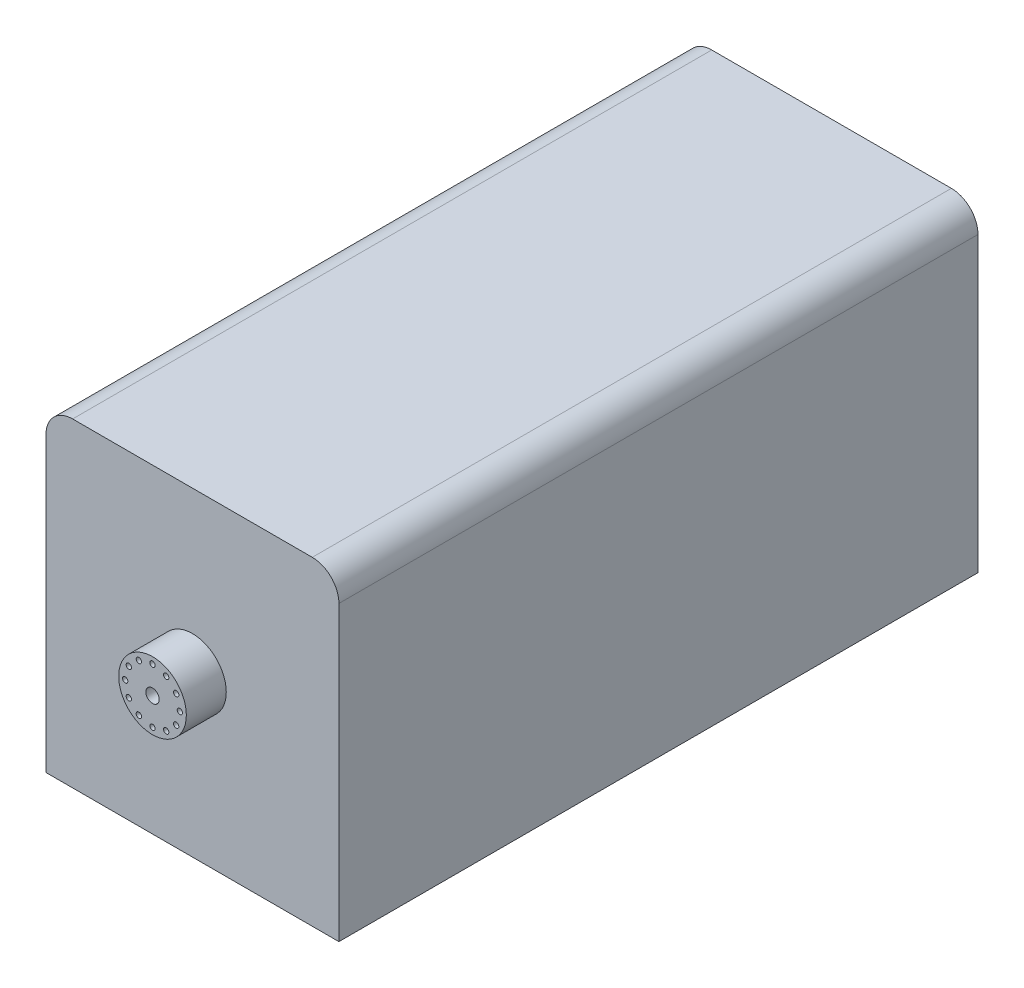
ISO-10303-21;
HEADER;
FILE_DESCRIPTION(('STEP AP214'),'2;1');
FILE_NAME('part.step','',(''),(''),'','','');
FILE_SCHEMA(('AUTOMOTIVE_DESIGN { 1 0 10303 214 1 1 1 1 }'));
ENDSEC;
DATA;
#1=APPLICATION_CONTEXT('core data for automotive mechanical design processes');
#2=APPLICATION_PROTOCOL_DEFINITION('international standard','automotive_design',2000,#1);
#3=PRODUCT_CONTEXT('',#1,'mechanical');
#4=PRODUCT('Part','Part','',(#3));
#5=PRODUCT_RELATED_PRODUCT_CATEGORY('part','',(#4));
#6=PRODUCT_DEFINITION_FORMATION('','',#4);
#7=PRODUCT_DEFINITION_CONTEXT('part definition',#1,'design');
#8=PRODUCT_DEFINITION('design','',#6,#7);
#9=PRODUCT_DEFINITION_SHAPE('','',#8);
#10=(LENGTH_UNIT() NAMED_UNIT(*) SI_UNIT(.MILLI.,.METRE.));
#11=(NAMED_UNIT(*) PLANE_ANGLE_UNIT() SI_UNIT($,.RADIAN.));
#12=(NAMED_UNIT(*) SI_UNIT($,.STERADIAN.) SOLID_ANGLE_UNIT());
#13=UNCERTAINTY_MEASURE_WITH_UNIT(LENGTH_MEASURE(1.E-05),#10,'distance_accuracy_value','');
#14=(GEOMETRIC_REPRESENTATION_CONTEXT(3) GLOBAL_UNCERTAINTY_ASSIGNED_CONTEXT((#13)) GLOBAL_UNIT_ASSIGNED_CONTEXT((#10,
#11,#12)) REPRESENTATION_CONTEXT('',''));
#15=CARTESIAN_POINT('',(0.,0.,0.));
#16=DIRECTION('',(0.,0.,1.));
#17=DIRECTION('',(1.,0.,0.));
#18=AXIS2_PLACEMENT_3D('',#15,#16,#17);
#19=CARTESIAN_POINT('',(-55.,60.,240.));
#20=DIRECTION('',(1.,0.,0.));
#21=DIRECTION('',(0.,1.,0.));
#22=AXIS2_PLACEMENT_3D('',#19,#20,#21);
#23=PLANE('',#22);
#24=DIRECTION('',(0.,-1.,0.));
#25=VECTOR('',#24,1.);
#26=CARTESIAN_POINT('',(-55.,60.,240.));
#27=LINE('',#26,#25);
#28=CARTESIAN_POINT('',(-55.,50.,240.));
#29=VERTEX_POINT('',#28);
#30=CARTESIAN_POINT('',(-55.,-60.,240.));
#31=VERTEX_POINT('',#30);
#32=EDGE_CURVE('E95',#29,#31,#27,.T.);
#33=ORIENTED_EDGE('',*,*,#32,.F.);
#34=DIRECTION('',(0.,0.,-1.));
#35=VECTOR('',#34,1.);
#36=CARTESIAN_POINT('',(-55.,50.,240.));
#37=LINE('',#36,#35);
#38=CARTESIAN_POINT('',(-55.,50.,0.));
#39=VERTEX_POINT('',#38);
#40=EDGE_CURVE('E119',#29,#39,#37,.T.);
#41=ORIENTED_EDGE('',*,*,#40,.T.);
#42=DIRECTION('',(0.,-1.,0.));
#43=VECTOR('',#42,1.);
#44=CARTESIAN_POINT('',(-55.,60.,0.));
#45=LINE('',#44,#43);
#46=CARTESIAN_POINT('',(-55.,-60.,0.));
#47=VERTEX_POINT('',#46);
#48=EDGE_CURVE('E117',#39,#47,#45,.T.);
#49=ORIENTED_EDGE('',*,*,#48,.T.);
#50=DIRECTION('',(0.,0.,-1.));
#51=VECTOR('',#50,1.);
#52=CARTESIAN_POINT('',(-55.,-60.,240.));
#53=LINE('',#52,#51);
#54=EDGE_CURVE('E111',#31,#47,#53,.T.);
#55=ORIENTED_EDGE('',*,*,#54,.F.);
#56=EDGE_LOOP('',(#33,#41,#49,#55));
#57=FACE_BOUND('',#56,.T.);
#58=ADVANCED_FACE('F38',(#57),#23,.F.);
#59=CARTESIAN_POINT('',(55.,-60.,240.));
#60=DIRECTION('',(0.,1.,0.));
#61=DIRECTION('',(-1.,0.,0.));
#62=AXIS2_PLACEMENT_3D('',#59,#60,#61);
#63=PLANE('',#62);
#64=CARTESIAN_POINT('',(-37.0591269929145,-60.,21.5690703436606));
#65=DIRECTION('',(0.,1.,0.));
#66=DIRECTION('',(-1.,0.,0.));
#67=AXIS2_PLACEMENT_3D('',#64,#65,#66);
#68=CIRCLE('',#67,7.5);
#69=CARTESIAN_POINT('',(-44.5591269929145,-60.,21.5690703436606));
#70=VERTEX_POINT('',#69);
#71=EDGE_CURVE('E42',#70,#70,#68,.F.);
#72=ORIENTED_EDGE('',*,*,#71,.F.);
#73=EDGE_LOOP('',(#72));
#74=FACE_BOUND('',#73,.T.);
#75=CARTESIAN_POINT('',(32.9408730070855,-60.,21.5690703436606));
#76=DIRECTION('',(0.,1.,0.));
#77=DIRECTION('',(-1.,0.,0.));
#78=AXIS2_PLACEMENT_3D('',#75,#76,#77);
#79=CIRCLE('',#78,7.5);
#80=CARTESIAN_POINT('',(25.4408730070855,-60.,21.5690703436606));
#81=VERTEX_POINT('',#80);
#82=EDGE_CURVE('E143',#81,#81,#79,.F.);
#83=ORIENTED_EDGE('',*,*,#82,.F.);
#84=EDGE_LOOP('',(#83));
#85=FACE_BOUND('',#84,.T.);
#86=CARTESIAN_POINT('',(32.9408730070855,-60.,221.569070343661));
#87=DIRECTION('',(0.,1.,0.));
#88=DIRECTION('',(-1.,0.,0.));
#89=AXIS2_PLACEMENT_3D('',#86,#87,#88);
#90=CIRCLE('',#89,7.5);
#91=CARTESIAN_POINT('',(25.4408730070855,-60.,221.569070343661));
#92=VERTEX_POINT('',#91);
#93=EDGE_CURVE('E141',#92,#92,#90,.F.);
#94=ORIENTED_EDGE('',*,*,#93,.F.);
#95=EDGE_LOOP('',(#94));
#96=FACE_BOUND('',#95,.T.);
#97=CARTESIAN_POINT('',(-37.0591269929145,-60.,221.569070343661));
#98=DIRECTION('',(0.,1.,0.));
#99=DIRECTION('',(-1.,0.,0.));
#100=AXIS2_PLACEMENT_3D('',#97,#98,#99);
#101=CIRCLE('',#100,7.5);
#102=CARTESIAN_POINT('',(-44.5591269929145,-60.,221.569070343661));
#103=VERTEX_POINT('',#102);
#104=EDGE_CURVE('E138',#103,#103,#101,.F.);
#105=ORIENTED_EDGE('',*,*,#104,.F.);
#106=EDGE_LOOP('',(#105));
#107=FACE_BOUND('',#106,.T.);
#108=DIRECTION('',(1.,0.,0.));
#109=VECTOR('',#108,1.);
#110=CARTESIAN_POINT('',(55.,-60.,0.));
#111=LINE('',#110,#109);
#112=CARTESIAN_POINT('',(55.,-60.,0.));
#113=VERTEX_POINT('',#112);
#114=EDGE_CURVE('E192',#47,#113,#111,.T.);
#115=ORIENTED_EDGE('',*,*,#114,.T.);
#116=DIRECTION('',(0.,0.,-1.));
#117=VECTOR('',#116,1.);
#118=CARTESIAN_POINT('',(55.,-60.,240.));
#119=LINE('',#118,#117);
#120=CARTESIAN_POINT('',(55.,-60.,240.));
#121=VERTEX_POINT('',#120);
#122=EDGE_CURVE('E113',#121,#113,#119,.T.);
#123=ORIENTED_EDGE('',*,*,#122,.F.);
#124=DIRECTION('',(1.,0.,0.));
#125=VECTOR('',#124,1.);
#126=CARTESIAN_POINT('',(55.,-60.,240.));
#127=LINE('',#126,#125);
#128=EDGE_CURVE('E98',#31,#121,#127,.T.);
#129=ORIENTED_EDGE('',*,*,#128,.F.);
#130=ORIENTED_EDGE('',*,*,#54,.T.);
#131=EDGE_LOOP('',(#115,#123,#129,#130));
#132=FACE_BOUND('',#131,.T.);
#133=ADVANCED_FACE('F110',(#74,#85,#96,#107,#132),#63,.F.);
#134=CARTESIAN_POINT('',(55.,60.,240.));
#135=DIRECTION('',(-1.,0.,0.));
#136=DIRECTION('',(0.,-1.,0.));
#137=AXIS2_PLACEMENT_3D('',#134,#135,#136);
#138=PLANE('',#137);
#139=DIRECTION('',(0.,1.,0.));
#140=VECTOR('',#139,1.);
#141=CARTESIAN_POINT('',(55.,60.,0.));
#142=LINE('',#141,#140);
#143=CARTESIAN_POINT('',(55.,50.,0.));
#144=VERTEX_POINT('',#143);
#145=EDGE_CURVE('E195',#113,#144,#142,.T.);
#146=ORIENTED_EDGE('',*,*,#145,.T.);
#147=DIRECTION('',(0.,0.,-1.));
#148=VECTOR('',#147,1.);
#149=CARTESIAN_POINT('',(55.,50.,240.));
#150=LINE('',#149,#148);
#151=CARTESIAN_POINT('',(55.,50.,240.));
#152=VERTEX_POINT('',#151);
#153=EDGE_CURVE('E54',#144,#152,#150,.F.);
#154=ORIENTED_EDGE('',*,*,#153,.T.);
#155=DIRECTION('',(0.,1.,0.));
#156=VECTOR('',#155,1.);
#157=CARTESIAN_POINT('',(55.,60.,240.));
#158=LINE('',#157,#156);
#159=EDGE_CURVE('E114',#121,#152,#158,.T.);
#160=ORIENTED_EDGE('',*,*,#159,.F.);
#161=ORIENTED_EDGE('',*,*,#122,.T.);
#162=EDGE_LOOP('',(#146,#154,#160,#161));
#163=FACE_BOUND('',#162,.T.);
#164=ADVANCED_FACE('F154',(#163),#138,.F.);
#165=CARTESIAN_POINT('',(55.,60.,240.));
#166=DIRECTION('',(0.,-1.,0.));
#167=DIRECTION('',(1.,0.,0.));
#168=AXIS2_PLACEMENT_3D('',#165,#166,#167);
#169=PLANE('',#168);
#170=DIRECTION('',(-1.,0.,0.));
#171=VECTOR('',#170,1.);
#172=CARTESIAN_POINT('',(55.,60.,0.));
#173=LINE('',#172,#171);
#174=CARTESIAN_POINT('',(45.,60.,0.));
#175=VERTEX_POINT('',#174);
#176=CARTESIAN_POINT('',(-45.,60.,0.));
#177=VERTEX_POINT('',#176);
#178=EDGE_CURVE('E106',#175,#177,#173,.T.);
#179=ORIENTED_EDGE('',*,*,#178,.T.);
#180=DIRECTION('',(0.,0.,-1.));
#181=VECTOR('',#180,1.);
#182=CARTESIAN_POINT('',(-45.,60.,240.));
#183=LINE('',#182,#181);
#184=CARTESIAN_POINT('',(-45.,60.,240.));
#185=VERTEX_POINT('',#184);
#186=EDGE_CURVE('E62',#177,#185,#183,.F.);
#187=ORIENTED_EDGE('',*,*,#186,.T.);
#188=DIRECTION('',(-1.,0.,0.));
#189=VECTOR('',#188,1.);
#190=CARTESIAN_POINT('',(55.,60.,240.));
#191=LINE('',#190,#189);
#192=CARTESIAN_POINT('',(45.,60.,240.));
#193=VERTEX_POINT('',#192);
#194=EDGE_CURVE('E123',#193,#185,#191,.T.);
#195=ORIENTED_EDGE('',*,*,#194,.F.);
#196=DIRECTION('',(0.,0.,-1.));
#197=VECTOR('',#196,1.);
#198=CARTESIAN_POINT('',(45.,60.,240.));
#199=LINE('',#198,#197);
#200=EDGE_CURVE('E130',#193,#175,#199,.T.);
#201=ORIENTED_EDGE('',*,*,#200,.T.);
#202=EDGE_LOOP('',(#179,#187,#195,#201));
#203=FACE_BOUND('',#202,.T.);
#204=ADVANCED_FACE('F203',(#203),#169,.F.);
#205=CARTESIAN_POINT('',(0.,0.,240.));
#206=DIRECTION('',(0.,0.,-1.));
#207=DIRECTION('',(-1.,0.,0.));
#208=AXIS2_PLACEMENT_3D('',#205,#206,#207);
#209=PLANE('',#208);
#210=CARTESIAN_POINT('',(0.,0.,240.));
#211=DIRECTION('',(0.,0.,1.));
#212=DIRECTION('',(1.,0.,0.));
#213=AXIS2_PLACEMENT_3D('',#210,#211,#212);
#214=CIRCLE('',#213,12.7);
#215=CARTESIAN_POINT('',(12.7,0.,240.));
#216=VERTEX_POINT('',#215);
#217=EDGE_CURVE('E11',#216,#216,#214,.T.);
#218=ORIENTED_EDGE('',*,*,#217,.F.);
#219=EDGE_LOOP('',(#218));
#220=FACE_BOUND('',#219,.T.);
#221=ORIENTED_EDGE('',*,*,#194,.T.);
#222=CARTESIAN_POINT('',(-45.,50.,240.));
#223=DIRECTION('',(0.,0.,-1.));
#224=DIRECTION('',(-1.,0.,0.));
#225=AXIS2_PLACEMENT_3D('',#222,#223,#224);
#226=CIRCLE('',#225,10.);
#227=EDGE_CURVE('E101',#185,#29,#226,.F.);
#228=ORIENTED_EDGE('',*,*,#227,.T.);
#229=ORIENTED_EDGE('',*,*,#32,.T.);
#230=ORIENTED_EDGE('',*,*,#128,.T.);
#231=ORIENTED_EDGE('',*,*,#159,.T.);
#232=CARTESIAN_POINT('',(45.,50.,240.));
#233=DIRECTION('',(0.,0.,-1.));
#234=DIRECTION('',(-1.,0.,0.));
#235=AXIS2_PLACEMENT_3D('',#232,#233,#234);
#236=CIRCLE('',#235,10.);
#237=EDGE_CURVE('E134',#152,#193,#236,.F.);
#238=ORIENTED_EDGE('',*,*,#237,.T.);
#239=EDGE_LOOP('',(#221,#228,#229,#230,#231,#238));
#240=FACE_BOUND('',#239,.T.);
#241=ADVANCED_FACE('F97',(#220,#240),#209,.F.);
#242=CARTESIAN_POINT('',(0.,0.,0.));
#243=DIRECTION('',(0.,0.,-1.));
#244=DIRECTION('',(-1.,0.,0.));
#245=AXIS2_PLACEMENT_3D('',#242,#243,#244);
#246=PLANE('',#245);
#247=ORIENTED_EDGE('',*,*,#48,.F.);
#248=CARTESIAN_POINT('',(-45.,50.,0.));
#249=DIRECTION('',(0.,0.,-1.));
#250=DIRECTION('',(-1.,0.,0.));
#251=AXIS2_PLACEMENT_3D('',#248,#249,#250);
#252=CIRCLE('',#251,10.);
#253=EDGE_CURVE('E128',#39,#177,#252,.T.);
#254=ORIENTED_EDGE('',*,*,#253,.T.);
#255=ORIENTED_EDGE('',*,*,#178,.F.);
#256=CARTESIAN_POINT('',(45.,50.,0.));
#257=DIRECTION('',(0.,0.,-1.));
#258=DIRECTION('',(-1.,0.,0.));
#259=AXIS2_PLACEMENT_3D('',#256,#257,#258);
#260=CIRCLE('',#259,10.);
#261=EDGE_CURVE('E121',#175,#144,#260,.T.);
#262=ORIENTED_EDGE('',*,*,#261,.T.);
#263=ORIENTED_EDGE('',*,*,#145,.F.);
#264=ORIENTED_EDGE('',*,*,#114,.F.);
#265=EDGE_LOOP('',(#247,#254,#255,#262,#263,#264));
#266=FACE_BOUND('',#265,.T.);
#267=ADVANCED_FACE('F183',(#266),#246,.T.);
#268=CARTESIAN_POINT('',(-45.,50.,240.));
#269=DIRECTION('',(0.,0.,-1.));
#270=DIRECTION('',(-1.,0.,0.));
#271=AXIS2_PLACEMENT_3D('',#268,#269,#270);
#272=CYLINDRICAL_SURFACE('',#271,10.);
#273=ORIENTED_EDGE('',*,*,#227,.F.);
#274=ORIENTED_EDGE('',*,*,#186,.F.);
#275=ORIENTED_EDGE('',*,*,#253,.F.);
#276=ORIENTED_EDGE('',*,*,#40,.F.);
#277=EDGE_LOOP('',(#273,#274,#275,#276));
#278=FACE_BOUND('',#277,.T.);
#279=ADVANCED_FACE('F173',(#278),#272,.T.);
#280=CARTESIAN_POINT('',(45.,50.,240.));
#281=DIRECTION('',(0.,0.,-1.));
#282=DIRECTION('',(-1.,0.,0.));
#283=AXIS2_PLACEMENT_3D('',#280,#281,#282);
#284=CYLINDRICAL_SURFACE('',#283,10.);
#285=ORIENTED_EDGE('',*,*,#237,.F.);
#286=ORIENTED_EDGE('',*,*,#153,.F.);
#287=ORIENTED_EDGE('',*,*,#261,.F.);
#288=ORIENTED_EDGE('',*,*,#200,.F.);
#289=EDGE_LOOP('',(#285,#286,#287,#288));
#290=FACE_BOUND('',#289,.T.);
#291=ADVANCED_FACE('F40',(#290),#284,.T.);
#292=CARTESIAN_POINT('',(-37.0591269929145,-70.,221.569070343661));
#293=DIRECTION('',(0.,1.,0.));
#294=DIRECTION('',(-1.,0.,0.));
#295=AXIS2_PLACEMENT_3D('',#292,#293,#294);
#296=CYLINDRICAL_SURFACE('',#295,7.5);
#297=CARTESIAN_POINT('',(-37.0591269929145,-70.,221.569070343661));
#298=DIRECTION('',(0.,-1.,0.));
#299=DIRECTION('',(1.,0.,0.));
#300=AXIS2_PLACEMENT_3D('',#297,#298,#299);
#301=CIRCLE('',#300,7.5);
#302=CARTESIAN_POINT('',(-29.5591269929145,-70.,221.569070343661));
#303=VERTEX_POINT('',#302);
#304=EDGE_CURVE('E193',#303,#303,#301,.T.);
#305=ORIENTED_EDGE('',*,*,#304,.F.);
#306=EDGE_LOOP('',(#305));
#307=FACE_BOUND('',#306,.T.);
#308=ORIENTED_EDGE('',*,*,#104,.T.);
#309=EDGE_LOOP('',(#308));
#310=FACE_BOUND('',#309,.T.);
#311=ADVANCED_FACE('F161',(#307,#310),#296,.T.);
#312=CARTESIAN_POINT('',(-37.0591269929145,-70.,221.569070343661));
#313=DIRECTION('',(0.,-1.,0.));
#314=DIRECTION('',(1.,0.,0.));
#315=AXIS2_PLACEMENT_3D('',#312,#313,#314);
#316=PLANE('',#315);
#317=ORIENTED_EDGE('',*,*,#304,.T.);
#318=EDGE_LOOP('',(#317));
#319=FACE_BOUND('',#318,.T.);
#320=ADVANCED_FACE('F163',(#319),#316,.T.);
#321=CARTESIAN_POINT('',(32.9408730070855,-70.,221.569070343661));
#322=DIRECTION('',(0.,1.,0.));
#323=DIRECTION('',(-1.,0.,0.));
#324=AXIS2_PLACEMENT_3D('',#321,#322,#323);
#325=CYLINDRICAL_SURFACE('',#324,7.5);
#326=CARTESIAN_POINT('',(32.9408730070855,-70.,221.569070343661));
#327=DIRECTION('',(0.,-1.,0.));
#328=DIRECTION('',(1.,0.,0.));
#329=AXIS2_PLACEMENT_3D('',#326,#327,#328);
#330=CIRCLE('',#329,7.5);
#331=CARTESIAN_POINT('',(40.4408730070855,-70.,221.569070343661));
#332=VERTEX_POINT('',#331);
#333=EDGE_CURVE('E198',#332,#332,#330,.T.);
#334=ORIENTED_EDGE('',*,*,#333,.F.);
#335=EDGE_LOOP('',(#334));
#336=FACE_BOUND('',#335,.T.);
#337=ORIENTED_EDGE('',*,*,#93,.T.);
#338=EDGE_LOOP('',(#337));
#339=FACE_BOUND('',#338,.T.);
#340=ADVANCED_FACE('F170',(#336,#339),#325,.T.);
#341=CARTESIAN_POINT('',(32.9408730070855,-70.,221.569070343661));
#342=DIRECTION('',(0.,-1.,0.));
#343=DIRECTION('',(1.,0.,0.));
#344=AXIS2_PLACEMENT_3D('',#341,#342,#343);
#345=PLANE('',#344);
#346=ORIENTED_EDGE('',*,*,#333,.T.);
#347=EDGE_LOOP('',(#346));
#348=FACE_BOUND('',#347,.T.);
#349=ADVANCED_FACE('F330',(#348),#345,.T.);
#350=CARTESIAN_POINT('',(32.9408730070855,-70.,21.5690703436606));
#351=DIRECTION('',(0.,1.,0.));
#352=DIRECTION('',(-1.,0.,0.));
#353=AXIS2_PLACEMENT_3D('',#350,#351,#352);
#354=CYLINDRICAL_SURFACE('',#353,7.5);
#355=CARTESIAN_POINT('',(32.9408730070855,-70.,21.5690703436606));
#356=DIRECTION('',(0.,-1.,0.));
#357=DIRECTION('',(1.,0.,0.));
#358=AXIS2_PLACEMENT_3D('',#355,#356,#357);
#359=CIRCLE('',#358,7.5);
#360=CARTESIAN_POINT('',(40.4408730070855,-70.,21.5690703436606));
#361=VERTEX_POINT('',#360);
#362=EDGE_CURVE('E209',#361,#361,#359,.T.);
#363=ORIENTED_EDGE('',*,*,#362,.F.);
#364=EDGE_LOOP('',(#363));
#365=FACE_BOUND('',#364,.T.);
#366=ORIENTED_EDGE('',*,*,#82,.T.);
#367=EDGE_LOOP('',(#366));
#368=FACE_BOUND('',#367,.T.);
#369=ADVANCED_FACE('F326',(#365,#368),#354,.T.);
#370=CARTESIAN_POINT('',(32.9408730070855,-70.,21.5690703436606));
#371=DIRECTION('',(0.,-1.,0.));
#372=DIRECTION('',(1.,0.,0.));
#373=AXIS2_PLACEMENT_3D('',#370,#371,#372);
#374=PLANE('',#373);
#375=ORIENTED_EDGE('',*,*,#362,.T.);
#376=EDGE_LOOP('',(#375));
#377=FACE_BOUND('',#376,.T.);
#378=ADVANCED_FACE('F322',(#377),#374,.T.);
#379=CARTESIAN_POINT('',(-37.0591269929145,-70.,21.5690703436606));
#380=DIRECTION('',(0.,1.,0.));
#381=DIRECTION('',(-1.,0.,0.));
#382=AXIS2_PLACEMENT_3D('',#379,#380,#381);
#383=CYLINDRICAL_SURFACE('',#382,7.5);
#384=CARTESIAN_POINT('',(-37.0591269929145,-70.,21.5690703436606));
#385=DIRECTION('',(0.,-1.,0.));
#386=DIRECTION('',(1.,0.,0.));
#387=AXIS2_PLACEMENT_3D('',#384,#385,#386);
#388=CIRCLE('',#387,7.5);
#389=CARTESIAN_POINT('',(-29.5591269929145,-70.,21.5690703436606));
#390=VERTEX_POINT('',#389);
#391=EDGE_CURVE('E212',#390,#390,#388,.T.);
#392=ORIENTED_EDGE('',*,*,#391,.F.);
#393=EDGE_LOOP('',(#392));
#394=FACE_BOUND('',#393,.T.);
#395=ORIENTED_EDGE('',*,*,#71,.T.);
#396=EDGE_LOOP('',(#395));
#397=FACE_BOUND('',#396,.T.);
#398=ADVANCED_FACE('F150',(#394,#397),#383,.T.);
#399=CARTESIAN_POINT('',(-37.0591269929145,-70.,21.5690703436606));
#400=DIRECTION('',(0.,-1.,0.));
#401=DIRECTION('',(1.,0.,0.));
#402=AXIS2_PLACEMENT_3D('',#399,#400,#401);
#403=PLANE('',#402);
#404=ORIENTED_EDGE('',*,*,#391,.T.);
#405=EDGE_LOOP('',(#404));
#406=FACE_BOUND('',#405,.T.);
#407=ADVANCED_FACE('F303',(#406),#403,.T.);
#408=CARTESIAN_POINT('',(0.,0.,255.));
#409=DIRECTION('',(0.,0.,1.));
#410=DIRECTION('',(1.,0.,0.));
#411=AXIS2_PLACEMENT_3D('',#408,#409,#410);
#412=PLANE('',#411);
#413=CARTESIAN_POINT('',(-5.1325060373812,-8.88976122689801,255.));
#414=DIRECTION('',(0.,0.,1.));
#415=DIRECTION('',(1.,0.,0.));
#416=AXIS2_PLACEMENT_3D('',#413,#414,#415);
#417=CIRCLE('',#416,1.);
#418=CARTESIAN_POINT('',(-4.1325060373812,-8.88976122689801,255.));
#419=VERTEX_POINT('',#418);
#420=EDGE_CURVE('E282',#419,#419,#417,.T.);
#421=ORIENTED_EDGE('',*,*,#420,.F.);
#422=EDGE_LOOP('',(#421));
#423=FACE_BOUND('',#422,.T.);
#424=CARTESIAN_POINT('',(5.13250603738102,-8.88976122689812,255.));
#425=DIRECTION('',(0.,0.,1.));
#426=DIRECTION('',(1.,0.,0.));
#427=AXIS2_PLACEMENT_3D('',#424,#425,#426);
#428=CIRCLE('',#427,1.);
#429=CARTESIAN_POINT('',(6.13250603738102,-8.88976122689812,255.));
#430=VERTEX_POINT('',#429);
#431=EDGE_CURVE('E270',#430,#430,#428,.T.);
#432=ORIENTED_EDGE('',*,*,#431,.F.);
#433=EDGE_LOOP('',(#432));
#434=FACE_BOUND('',#433,.T.);
#435=CARTESIAN_POINT('',(10.2650120747622,0.,255.));
#436=DIRECTION('',(0.,0.,1.));
#437=DIRECTION('',(1.,0.,0.));
#438=AXIS2_PLACEMENT_3D('',#435,#436,#437);
#439=CIRCLE('',#438,1.);
#440=CARTESIAN_POINT('',(11.2650120747622,0.,255.));
#441=VERTEX_POINT('',#440);
#442=EDGE_CURVE('E258',#441,#441,#439,.T.);
#443=ORIENTED_EDGE('',*,*,#442,.F.);
#444=EDGE_LOOP('',(#443));
#445=FACE_BOUND('',#444,.T.);
#446=CARTESIAN_POINT('',(5.13250603738114,8.88976122689805,255.));
#447=DIRECTION('',(0.,0.,1.));
#448=DIRECTION('',(1.,0.,0.));
#449=AXIS2_PLACEMENT_3D('',#446,#447,#448);
#450=CIRCLE('',#449,1.);
#451=CARTESIAN_POINT('',(6.13250603738115,8.88976122689805,255.));
#452=VERTEX_POINT('',#451);
#453=EDGE_CURVE('E246',#452,#452,#450,.T.);
#454=ORIENTED_EDGE('',*,*,#453,.F.);
#455=EDGE_LOOP('',(#454));
#456=FACE_BOUND('',#455,.T.);
#457=CARTESIAN_POINT('',(-5.13250603738108,8.88976122689809,255.));
#458=DIRECTION('',(0.,0.,1.));
#459=DIRECTION('',(1.,0.,0.));
#460=AXIS2_PLACEMENT_3D('',#457,#458,#459);
#461=CIRCLE('',#460,1.);
#462=CARTESIAN_POINT('',(-4.13250603738108,8.88976122689809,255.));
#463=VERTEX_POINT('',#462);
#464=EDGE_CURVE('E234',#463,#463,#461,.T.);
#465=ORIENTED_EDGE('',*,*,#464,.F.);
#466=EDGE_LOOP('',(#465));
#467=FACE_BOUND('',#466,.T.);
#468=CARTESIAN_POINT('',(-10.2650120747622,0.,255.));
#469=DIRECTION('',(0.,0.,1.));
#470=DIRECTION('',(1.,0.,0.));
#471=AXIS2_PLACEMENT_3D('',#468,#469,#470);
#472=CIRCLE('',#471,1.);
#473=CARTESIAN_POINT('',(-9.2650120747622,0.,255.));
#474=VERTEX_POINT('',#473);
#475=EDGE_CURVE('E222',#474,#474,#472,.T.);
#476=ORIENTED_EDGE('',*,*,#475,.F.);
#477=EDGE_LOOP('',(#476));
#478=FACE_BOUND('',#477,.T.);
#479=CARTESIAN_POINT('',(0.,0.,255.));
#480=DIRECTION('',(0.,0.,1.));
#481=DIRECTION('',(1.,0.,0.));
#482=AXIS2_PLACEMENT_3D('',#479,#480,#481);
#483=CIRCLE('',#482,12.7);
#484=CARTESIAN_POINT('',(12.7,0.,255.));
#485=VERTEX_POINT('',#484);
#486=EDGE_CURVE('E214',#485,#485,#483,.T.);
#487=ORIENTED_EDGE('',*,*,#486,.T.);
#488=EDGE_LOOP('',(#487));
#489=FACE_BOUND('',#488,.T.);
#490=CARTESIAN_POINT('',(0.,0.,255.));
#491=DIRECTION('',(0.,0.,1.));
#492=DIRECTION('',(1.,0.,0.));
#493=AXIS2_PLACEMENT_3D('',#490,#491,#492);
#494=CIRCLE('',#493,2.51671965392214);
#495=CARTESIAN_POINT('',(2.51671965392214,0.,255.));
#496=VERTEX_POINT('',#495);
#497=EDGE_CURVE('E218',#496,#496,#494,.T.);
#498=ORIENTED_EDGE('',*,*,#497,.F.);
#499=EDGE_LOOP('',(#498));
#500=FACE_BOUND('',#499,.T.);
#501=CARTESIAN_POINT('',(-8.88976122689807,5.13250603738111,255.));
#502=DIRECTION('',(0.,0.,1.));
#503=DIRECTION('',(1.,0.,0.));
#504=AXIS2_PLACEMENT_3D('',#501,#502,#503);
#505=CIRCLE('',#504,1.);
#506=CARTESIAN_POINT('',(-7.88976122689806,5.13250603738111,255.));
#507=VERTEX_POINT('',#506);
#508=EDGE_CURVE('E228',#507,#507,#505,.T.);
#509=ORIENTED_EDGE('',*,*,#508,.F.);
#510=EDGE_LOOP('',(#509));
#511=FACE_BOUND('',#510,.T.);
#512=CARTESIAN_POINT('',(0.,10.2650120747622,255.));
#513=DIRECTION('',(0.,0.,1.));
#514=DIRECTION('',(1.,0.,0.));
#515=AXIS2_PLACEMENT_3D('',#512,#513,#514);
#516=CIRCLE('',#515,1.);
#517=CARTESIAN_POINT('',(1.00000000000004,10.2650120747622,255.));
#518=VERTEX_POINT('',#517);
#519=EDGE_CURVE('E240',#518,#518,#516,.T.);
#520=ORIENTED_EDGE('',*,*,#519,.F.);
#521=EDGE_LOOP('',(#520));
#522=FACE_BOUND('',#521,.T.);
#523=CARTESIAN_POINT('',(8.8897612268981,5.13250603738105,255.));
#524=DIRECTION('',(0.,0.,1.));
#525=DIRECTION('',(1.,0.,0.));
#526=AXIS2_PLACEMENT_3D('',#523,#524,#525);
#527=CIRCLE('',#526,1.);
#528=CARTESIAN_POINT('',(9.88976122689811,5.13250603738105,255.));
#529=VERTEX_POINT('',#528);
#530=EDGE_CURVE('E252',#529,#529,#527,.T.);
#531=ORIENTED_EDGE('',*,*,#530,.F.);
#532=EDGE_LOOP('',(#531));
#533=FACE_BOUND('',#532,.T.);
#534=CARTESIAN_POINT('',(8.88976122689803,-5.13250603738117,255.));
#535=DIRECTION('',(0.,0.,1.));
#536=DIRECTION('',(1.,0.,0.));
#537=AXIS2_PLACEMENT_3D('',#534,#535,#536);
#538=CIRCLE('',#537,1.);
#539=CARTESIAN_POINT('',(9.88976122689803,-5.13250603738117,255.));
#540=VERTEX_POINT('',#539);
#541=EDGE_CURVE('E264',#540,#540,#538,.T.);
#542=ORIENTED_EDGE('',*,*,#541,.F.);
#543=EDGE_LOOP('',(#542));
#544=FACE_BOUND('',#543,.T.);
#545=CARTESIAN_POINT('',(-1.07520294306095E-13,-10.2650120747622,255.));
#546=DIRECTION('',(0.,0.,1.));
#547=DIRECTION('',(1.,0.,0.));
#548=AXIS2_PLACEMENT_3D('',#545,#546,#547);
#549=CIRCLE('',#548,1.);
#550=CARTESIAN_POINT('',(0.999999999999894,-10.2650120747622,255.));
#551=VERTEX_POINT('',#550);
#552=EDGE_CURVE('E276',#551,#551,#549,.T.);
#553=ORIENTED_EDGE('',*,*,#552,.F.);
#554=EDGE_LOOP('',(#553));
#555=FACE_BOUND('',#554,.T.);
#556=CARTESIAN_POINT('',(-8.88976122689814,-5.13250603738099,255.));
#557=DIRECTION('',(0.,0.,1.));
#558=DIRECTION('',(1.,0.,0.));
#559=AXIS2_PLACEMENT_3D('',#556,#557,#558);
#560=CIRCLE('',#559,1.);
#561=CARTESIAN_POINT('',(-7.88976122689814,-5.13250603738099,255.));
#562=VERTEX_POINT('',#561);
#563=EDGE_CURVE('E288',#562,#562,#560,.T.);
#564=ORIENTED_EDGE('',*,*,#563,.F.);
#565=EDGE_LOOP('',(#564));
#566=FACE_BOUND('',#565,.T.);
#567=ADVANCED_FACE('F300',(#423,#434,#445,#456,#467,#478,#489,#500,#511,#522,#533,#544,#555,
#566),#412,.T.);
#568=CARTESIAN_POINT('',(0.,0.,255.));
#569=DIRECTION('',(0.,0.,-1.));
#570=DIRECTION('',(-1.,0.,0.));
#571=AXIS2_PLACEMENT_3D('',#568,#569,#570);
#572=CYLINDRICAL_SURFACE('',#571,12.7);
#573=ORIENTED_EDGE('',*,*,#486,.F.);
#574=EDGE_LOOP('',(#573));
#575=FACE_BOUND('',#574,.T.);
#576=ORIENTED_EDGE('',*,*,#217,.T.);
#577=EDGE_LOOP('',(#576));
#578=FACE_BOUND('',#577,.T.);
#579=ADVANCED_FACE('F302',(#575,#578),#572,.T.);
#580=CARTESIAN_POINT('',(0.,0.,255.));
#581=DIRECTION('',(0.,0.,-1.));
#582=DIRECTION('',(-1.,0.,0.));
#583=AXIS2_PLACEMENT_3D('',#580,#581,#582);
#584=CYLINDRICAL_SURFACE('',#583,2.51671965392214);
#585=ORIENTED_EDGE('',*,*,#497,.T.);
#586=EDGE_LOOP('',(#585));
#587=FACE_BOUND('',#586,.T.);
#588=CARTESIAN_POINT('',(0.,0.,240.));
#589=DIRECTION('',(0.,0.,1.));
#590=DIRECTION('',(1.,0.,0.));
#591=AXIS2_PLACEMENT_3D('',#588,#589,#590);
#592=CIRCLE('',#591,2.51671965392214);
#593=CARTESIAN_POINT('',(2.51671965392214,0.,240.));
#594=VERTEX_POINT('',#593);
#595=EDGE_CURVE('E219',#594,#594,#592,.T.);
#596=ORIENTED_EDGE('',*,*,#595,.F.);
#597=EDGE_LOOP('',(#596));
#598=FACE_BOUND('',#597,.T.);
#599=ADVANCED_FACE('F310',(#587,#598),#584,.F.);
#600=CARTESIAN_POINT('',(-10.2650120747622,0.,255.));
#601=DIRECTION('',(0.,0.,-1.));
#602=DIRECTION('',(-1.,0.,0.));
#603=AXIS2_PLACEMENT_3D('',#600,#601,#602);
#604=CYLINDRICAL_SURFACE('',#603,1.);
#605=ORIENTED_EDGE('',*,*,#475,.T.);
#606=EDGE_LOOP('',(#605));
#607=FACE_BOUND('',#606,.T.);
#608=CARTESIAN_POINT('',(-10.2650120747622,0.,240.));
#609=DIRECTION('',(0.,0.,1.));
#610=DIRECTION('',(1.,0.,0.));
#611=AXIS2_PLACEMENT_3D('',#608,#609,#610);
#612=CIRCLE('',#611,1.);
#613=CARTESIAN_POINT('',(-9.2650120747622,0.,240.));
#614=VERTEX_POINT('',#613);
#615=EDGE_CURVE('E225',#614,#614,#612,.T.);
#616=ORIENTED_EDGE('',*,*,#615,.F.);
#617=EDGE_LOOP('',(#616));
#618=FACE_BOUND('',#617,.T.);
#619=ADVANCED_FACE('F397',(#607,#618),#604,.F.);
#620=CARTESIAN_POINT('',(-8.88976122689807,5.13250603738111,255.));
#621=DIRECTION('',(0.,0.,-1.));
#622=DIRECTION('',(-1.,0.,0.));
#623=AXIS2_PLACEMENT_3D('',#620,#621,#622);
#624=CYLINDRICAL_SURFACE('',#623,1.);
#625=ORIENTED_EDGE('',*,*,#508,.T.);
#626=EDGE_LOOP('',(#625));
#627=FACE_BOUND('',#626,.T.);
#628=CARTESIAN_POINT('',(-8.88976122689807,5.13250603738111,240.));
#629=DIRECTION('',(0.,0.,1.));
#630=DIRECTION('',(1.,0.,0.));
#631=AXIS2_PLACEMENT_3D('',#628,#629,#630);
#632=CIRCLE('',#631,1.);
#633=CARTESIAN_POINT('',(-7.88976122689806,5.13250603738111,240.));
#634=VERTEX_POINT('',#633);
#635=EDGE_CURVE('E231',#634,#634,#632,.T.);
#636=ORIENTED_EDGE('',*,*,#635,.F.);
#637=EDGE_LOOP('',(#636));
#638=FACE_BOUND('',#637,.T.);
#639=ADVANCED_FACE('F406',(#627,#638),#624,.F.);
#640=CARTESIAN_POINT('',(-5.13250603738108,8.88976122689809,255.));
#641=DIRECTION('',(0.,0.,-1.));
#642=DIRECTION('',(-1.,0.,0.));
#643=AXIS2_PLACEMENT_3D('',#640,#641,#642);
#644=CYLINDRICAL_SURFACE('',#643,1.);
#645=ORIENTED_EDGE('',*,*,#464,.T.);
#646=EDGE_LOOP('',(#645));
#647=FACE_BOUND('',#646,.T.);
#648=CARTESIAN_POINT('',(-5.13250603738108,8.88976122689809,240.));
#649=DIRECTION('',(0.,0.,1.));
#650=DIRECTION('',(1.,0.,0.));
#651=AXIS2_PLACEMENT_3D('',#648,#649,#650);
#652=CIRCLE('',#651,1.);
#653=CARTESIAN_POINT('',(-4.13250603738108,8.88976122689809,240.));
#654=VERTEX_POINT('',#653);
#655=EDGE_CURVE('E237',#654,#654,#652,.T.);
#656=ORIENTED_EDGE('',*,*,#655,.F.);
#657=EDGE_LOOP('',(#656));
#658=FACE_BOUND('',#657,.T.);
#659=ADVANCED_FACE('F415',(#647,#658),#644,.F.);
#660=CARTESIAN_POINT('',(0.,10.2650120747622,255.));
#661=DIRECTION('',(0.,0.,-1.));
#662=DIRECTION('',(-1.,0.,0.));
#663=AXIS2_PLACEMENT_3D('',#660,#661,#662);
#664=CYLINDRICAL_SURFACE('',#663,1.);
#665=ORIENTED_EDGE('',*,*,#519,.T.);
#666=EDGE_LOOP('',(#665));
#667=FACE_BOUND('',#666,.T.);
#668=CARTESIAN_POINT('',(0.,10.2650120747622,240.));
#669=DIRECTION('',(0.,0.,1.));
#670=DIRECTION('',(1.,0.,0.));
#671=AXIS2_PLACEMENT_3D('',#668,#669,#670);
#672=CIRCLE('',#671,1.);
#673=CARTESIAN_POINT('',(1.00000000000004,10.2650120747622,240.));
#674=VERTEX_POINT('',#673);
#675=EDGE_CURVE('E243',#674,#674,#672,.T.);
#676=ORIENTED_EDGE('',*,*,#675,.F.);
#677=EDGE_LOOP('',(#676));
#678=FACE_BOUND('',#677,.T.);
#679=ADVANCED_FACE('F425',(#667,#678),#664,.F.);
#680=CARTESIAN_POINT('',(5.13250603738114,8.88976122689805,255.));
#681=DIRECTION('',(0.,0.,-1.));
#682=DIRECTION('',(-1.,0.,0.));
#683=AXIS2_PLACEMENT_3D('',#680,#681,#682);
#684=CYLINDRICAL_SURFACE('',#683,1.);
#685=ORIENTED_EDGE('',*,*,#453,.T.);
#686=EDGE_LOOP('',(#685));
#687=FACE_BOUND('',#686,.T.);
#688=CARTESIAN_POINT('',(5.13250603738114,8.88976122689805,240.));
#689=DIRECTION('',(0.,0.,1.));
#690=DIRECTION('',(1.,0.,0.));
#691=AXIS2_PLACEMENT_3D('',#688,#689,#690);
#692=CIRCLE('',#691,1.);
#693=CARTESIAN_POINT('',(6.13250603738115,8.88976122689805,240.));
#694=VERTEX_POINT('',#693);
#695=EDGE_CURVE('E249',#694,#694,#692,.T.);
#696=ORIENTED_EDGE('',*,*,#695,.F.);
#697=EDGE_LOOP('',(#696));
#698=FACE_BOUND('',#697,.T.);
#699=ADVANCED_FACE('F435',(#687,#698),#684,.F.);
#700=CARTESIAN_POINT('',(8.8897612268981,5.13250603738105,255.));
#701=DIRECTION('',(0.,0.,-1.));
#702=DIRECTION('',(-1.,0.,0.));
#703=AXIS2_PLACEMENT_3D('',#700,#701,#702);
#704=CYLINDRICAL_SURFACE('',#703,1.);
#705=ORIENTED_EDGE('',*,*,#530,.T.);
#706=EDGE_LOOP('',(#705));
#707=FACE_BOUND('',#706,.T.);
#708=CARTESIAN_POINT('',(8.8897612268981,5.13250603738105,240.));
#709=DIRECTION('',(0.,0.,1.));
#710=DIRECTION('',(1.,0.,0.));
#711=AXIS2_PLACEMENT_3D('',#708,#709,#710);
#712=CIRCLE('',#711,1.);
#713=CARTESIAN_POINT('',(9.88976122689811,5.13250603738105,240.));
#714=VERTEX_POINT('',#713);
#715=EDGE_CURVE('E255',#714,#714,#712,.T.);
#716=ORIENTED_EDGE('',*,*,#715,.F.);
#717=EDGE_LOOP('',(#716));
#718=FACE_BOUND('',#717,.T.);
#719=ADVANCED_FACE('F445',(#707,#718),#704,.F.);
#720=CARTESIAN_POINT('',(10.2650120747622,0.,255.));
#721=DIRECTION('',(0.,0.,-1.));
#722=DIRECTION('',(-1.,0.,0.));
#723=AXIS2_PLACEMENT_3D('',#720,#721,#722);
#724=CYLINDRICAL_SURFACE('',#723,1.);
#725=ORIENTED_EDGE('',*,*,#442,.T.);
#726=EDGE_LOOP('',(#725));
#727=FACE_BOUND('',#726,.T.);
#728=CARTESIAN_POINT('',(10.2650120747622,0.,240.));
#729=DIRECTION('',(0.,0.,1.));
#730=DIRECTION('',(1.,0.,0.));
#731=AXIS2_PLACEMENT_3D('',#728,#729,#730);
#732=CIRCLE('',#731,1.);
#733=CARTESIAN_POINT('',(11.2650120747622,0.,240.));
#734=VERTEX_POINT('',#733);
#735=EDGE_CURVE('E261',#734,#734,#732,.T.);
#736=ORIENTED_EDGE('',*,*,#735,.F.);
#737=EDGE_LOOP('',(#736));
#738=FACE_BOUND('',#737,.T.);
#739=ADVANCED_FACE('F455',(#727,#738),#724,.F.);
#740=CARTESIAN_POINT('',(8.88976122689803,-5.13250603738117,255.));
#741=DIRECTION('',(0.,0.,-1.));
#742=DIRECTION('',(-1.,0.,0.));
#743=AXIS2_PLACEMENT_3D('',#740,#741,#742);
#744=CYLINDRICAL_SURFACE('',#743,1.);
#745=ORIENTED_EDGE('',*,*,#541,.T.);
#746=EDGE_LOOP('',(#745));
#747=FACE_BOUND('',#746,.T.);
#748=CARTESIAN_POINT('',(8.88976122689803,-5.13250603738117,240.));
#749=DIRECTION('',(0.,0.,1.));
#750=DIRECTION('',(1.,0.,0.));
#751=AXIS2_PLACEMENT_3D('',#748,#749,#750);
#752=CIRCLE('',#751,1.);
#753=CARTESIAN_POINT('',(9.88976122689803,-5.13250603738117,240.));
#754=VERTEX_POINT('',#753);
#755=EDGE_CURVE('E267',#754,#754,#752,.T.);
#756=ORIENTED_EDGE('',*,*,#755,.F.);
#757=EDGE_LOOP('',(#756));
#758=FACE_BOUND('',#757,.T.);
#759=ADVANCED_FACE('F465',(#747,#758),#744,.F.);
#760=CARTESIAN_POINT('',(5.13250603738102,-8.88976122689812,255.));
#761=DIRECTION('',(0.,0.,-1.));
#762=DIRECTION('',(-1.,0.,0.));
#763=AXIS2_PLACEMENT_3D('',#760,#761,#762);
#764=CYLINDRICAL_SURFACE('',#763,1.);
#765=ORIENTED_EDGE('',*,*,#431,.T.);
#766=EDGE_LOOP('',(#765));
#767=FACE_BOUND('',#766,.T.);
#768=CARTESIAN_POINT('',(5.13250603738102,-8.88976122689812,240.));
#769=DIRECTION('',(0.,0.,1.));
#770=DIRECTION('',(1.,0.,0.));
#771=AXIS2_PLACEMENT_3D('',#768,#769,#770);
#772=CIRCLE('',#771,1.);
#773=CARTESIAN_POINT('',(6.13250603738102,-8.88976122689812,240.));
#774=VERTEX_POINT('',#773);
#775=EDGE_CURVE('E273',#774,#774,#772,.T.);
#776=ORIENTED_EDGE('',*,*,#775,.F.);
#777=EDGE_LOOP('',(#776));
#778=FACE_BOUND('',#777,.T.);
#779=ADVANCED_FACE('F475',(#767,#778),#764,.F.);
#780=CARTESIAN_POINT('',(-1.07520294306095E-13,-10.2650120747622,255.));
#781=DIRECTION('',(0.,0.,-1.));
#782=DIRECTION('',(-1.,0.,0.));
#783=AXIS2_PLACEMENT_3D('',#780,#781,#782);
#784=CYLINDRICAL_SURFACE('',#783,1.);
#785=ORIENTED_EDGE('',*,*,#552,.T.);
#786=EDGE_LOOP('',(#785));
#787=FACE_BOUND('',#786,.T.);
#788=CARTESIAN_POINT('',(-1.07520294306095E-13,-10.2650120747622,240.));
#789=DIRECTION('',(0.,0.,1.));
#790=DIRECTION('',(1.,0.,0.));
#791=AXIS2_PLACEMENT_3D('',#788,#789,#790);
#792=CIRCLE('',#791,1.);
#793=CARTESIAN_POINT('',(0.999999999999894,-10.2650120747622,240.));
#794=VERTEX_POINT('',#793);
#795=EDGE_CURVE('E279',#794,#794,#792,.T.);
#796=ORIENTED_EDGE('',*,*,#795,.F.);
#797=EDGE_LOOP('',(#796));
#798=FACE_BOUND('',#797,.T.);
#799=ADVANCED_FACE('F485',(#787,#798),#784,.F.);
#800=CARTESIAN_POINT('',(-5.1325060373812,-8.88976122689801,255.));
#801=DIRECTION('',(0.,0.,-1.));
#802=DIRECTION('',(-1.,0.,0.));
#803=AXIS2_PLACEMENT_3D('',#800,#801,#802);
#804=CYLINDRICAL_SURFACE('',#803,1.);
#805=ORIENTED_EDGE('',*,*,#420,.T.);
#806=EDGE_LOOP('',(#805));
#807=FACE_BOUND('',#806,.T.);
#808=CARTESIAN_POINT('',(-5.1325060373812,-8.88976122689801,240.));
#809=DIRECTION('',(0.,0.,1.));
#810=DIRECTION('',(1.,0.,0.));
#811=AXIS2_PLACEMENT_3D('',#808,#809,#810);
#812=CIRCLE('',#811,1.);
#813=CARTESIAN_POINT('',(-4.1325060373812,-8.88976122689801,240.));
#814=VERTEX_POINT('',#813);
#815=EDGE_CURVE('E285',#814,#814,#812,.T.);
#816=ORIENTED_EDGE('',*,*,#815,.F.);
#817=EDGE_LOOP('',(#816));
#818=FACE_BOUND('',#817,.T.);
#819=ADVANCED_FACE('F495',(#807,#818),#804,.F.);
#820=CARTESIAN_POINT('',(-8.88976122689814,-5.13250603738099,255.));
#821=DIRECTION('',(0.,0.,-1.));
#822=DIRECTION('',(-1.,0.,0.));
#823=AXIS2_PLACEMENT_3D('',#820,#821,#822);
#824=CYLINDRICAL_SURFACE('',#823,1.);
#825=ORIENTED_EDGE('',*,*,#563,.T.);
#826=EDGE_LOOP('',(#825));
#827=FACE_BOUND('',#826,.T.);
#828=CARTESIAN_POINT('',(-8.88976122689814,-5.13250603738099,240.));
#829=DIRECTION('',(0.,0.,1.));
#830=DIRECTION('',(1.,0.,0.));
#831=AXIS2_PLACEMENT_3D('',#828,#829,#830);
#832=CIRCLE('',#831,1.);
#833=CARTESIAN_POINT('',(-7.88976122689814,-5.13250603738099,240.));
#834=VERTEX_POINT('',#833);
#835=EDGE_CURVE('E291',#834,#834,#832,.T.);
#836=ORIENTED_EDGE('',*,*,#835,.F.);
#837=EDGE_LOOP('',(#836));
#838=FACE_BOUND('',#837,.T.);
#839=ADVANCED_FACE('F297',(#827,#838),#824,.F.);
#840=ORIENTED_EDGE('',*,*,#815,.T.);
#841=EDGE_LOOP('',(#840));
#842=FACE_BOUND('',#841,.T.);
#843=ADVANCED_FACE('F514',(#842),#209,.F.);
#844=ORIENTED_EDGE('',*,*,#795,.T.);
#845=EDGE_LOOP('',(#844));
#846=FACE_BOUND('',#845,.T.);
#847=ADVANCED_FACE('F523',(#846),#209,.F.);
#848=ORIENTED_EDGE('',*,*,#775,.T.);
#849=EDGE_LOOP('',(#848));
#850=FACE_BOUND('',#849,.T.);
#851=ADVANCED_FACE('F532',(#850),#209,.F.);
#852=ORIENTED_EDGE('',*,*,#755,.T.);
#853=EDGE_LOOP('',(#852));
#854=FACE_BOUND('',#853,.T.);
#855=ADVANCED_FACE('F541',(#854),#209,.F.);
#856=ORIENTED_EDGE('',*,*,#735,.T.);
#857=EDGE_LOOP('',(#856));
#858=FACE_BOUND('',#857,.T.);
#859=ADVANCED_FACE('F550',(#858),#209,.F.);
#860=ORIENTED_EDGE('',*,*,#715,.T.);
#861=EDGE_LOOP('',(#860));
#862=FACE_BOUND('',#861,.T.);
#863=ADVANCED_FACE('F559',(#862),#209,.F.);
#864=ORIENTED_EDGE('',*,*,#695,.T.);
#865=EDGE_LOOP('',(#864));
#866=FACE_BOUND('',#865,.T.);
#867=ADVANCED_FACE('F568',(#866),#209,.F.);
#868=ORIENTED_EDGE('',*,*,#675,.T.);
#869=EDGE_LOOP('',(#868));
#870=FACE_BOUND('',#869,.T.);
#871=ADVANCED_FACE('F577',(#870),#209,.F.);
#872=ORIENTED_EDGE('',*,*,#655,.T.);
#873=EDGE_LOOP('',(#872));
#874=FACE_BOUND('',#873,.T.);
#875=ADVANCED_FACE('F586',(#874),#209,.F.);
#876=ORIENTED_EDGE('',*,*,#635,.T.);
#877=EDGE_LOOP('',(#876));
#878=FACE_BOUND('',#877,.T.);
#879=ADVANCED_FACE('F595',(#878),#209,.F.);
#880=ORIENTED_EDGE('',*,*,#615,.T.);
#881=EDGE_LOOP('',(#880));
#882=FACE_BOUND('',#881,.T.);
#883=ADVANCED_FACE('F604',(#882),#209,.F.);
#884=ORIENTED_EDGE('',*,*,#595,.T.);
#885=EDGE_LOOP('',(#884));
#886=FACE_BOUND('',#885,.T.);
#887=ADVANCED_FACE('F374',(#886),#209,.F.);
#888=ORIENTED_EDGE('',*,*,#835,.T.);
#889=EDGE_LOOP('',(#888));
#890=FACE_BOUND('',#889,.T.);
#891=ADVANCED_FACE('F375',(#890),#209,.F.);
#892=CLOSED_SHELL('',(#58,#133,#164,#204,#241,#267,#279,#291,#311,#320,#340,#349,#369,#378,#398,
#407,#567,#579,#599,#619,#639,#659,#679,#699,#719,#739,#759,#779,#799,#819,#839,#843,#847,#851,
#855,#859,#863,#867,#871,#875,#879,#883,#887,#891));
#893=MANIFOLD_SOLID_BREP('B2',#892);
#894=ADVANCED_BREP_SHAPE_REPRESENTATION('',(#18,#893),#14);
#895=SHAPE_DEFINITION_REPRESENTATION(#9,#894);
ENDSEC;
END-ISO-10303-21;
